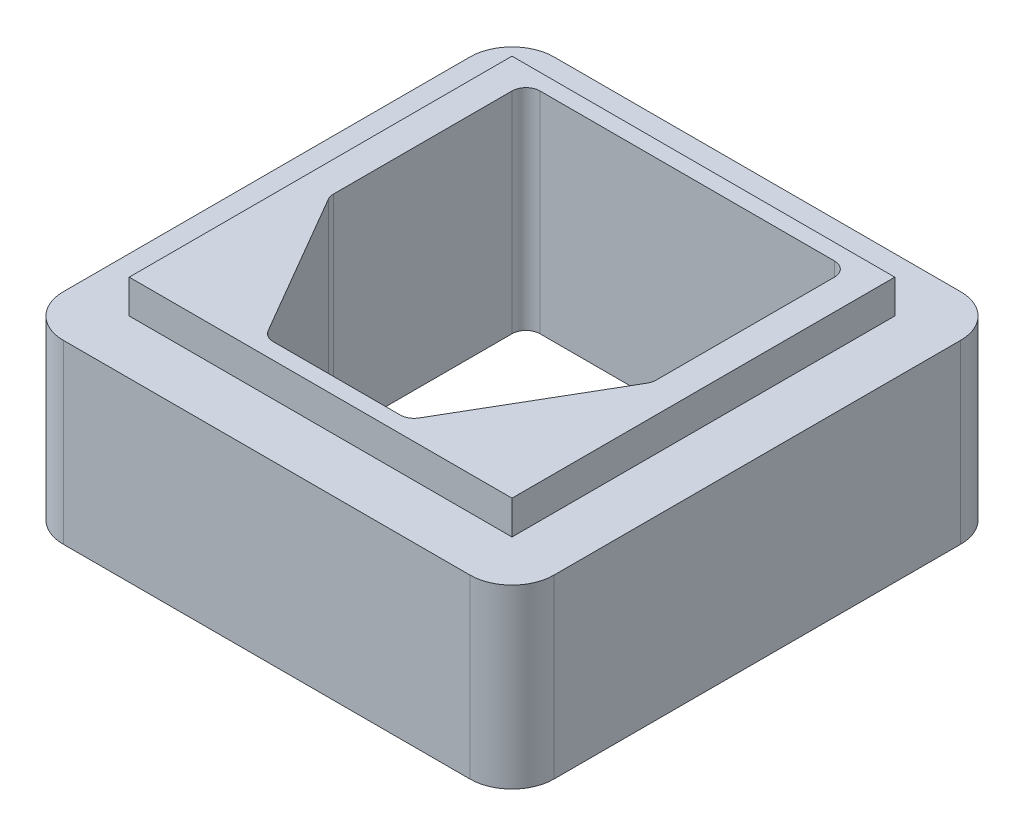
ISO-10303-21;
HEADER;
FILE_DESCRIPTION(('STEP AP214'),'2;1');
FILE_NAME('part.step','',(''),(''),'','','');
FILE_SCHEMA(('AUTOMOTIVE_DESIGN { 1 0 10303 214 1 1 1 1 }'));
ENDSEC;
DATA;
#1=APPLICATION_CONTEXT('core data for automotive mechanical design processes');
#2=APPLICATION_PROTOCOL_DEFINITION('international standard','automotive_design',2000,#1);
#3=PRODUCT_CONTEXT('',#1,'mechanical');
#4=PRODUCT('Part','Part','',(#3));
#5=PRODUCT_RELATED_PRODUCT_CATEGORY('part','',(#4));
#6=PRODUCT_DEFINITION_FORMATION('','',#4);
#7=PRODUCT_DEFINITION_CONTEXT('part definition',#1,'design');
#8=PRODUCT_DEFINITION('design','',#6,#7);
#9=PRODUCT_DEFINITION_SHAPE('','',#8);
#10=(LENGTH_UNIT() NAMED_UNIT(*) SI_UNIT(.MILLI.,.METRE.));
#11=(NAMED_UNIT(*) PLANE_ANGLE_UNIT() SI_UNIT($,.RADIAN.));
#12=(NAMED_UNIT(*) SI_UNIT($,.STERADIAN.) SOLID_ANGLE_UNIT());
#13=UNCERTAINTY_MEASURE_WITH_UNIT(LENGTH_MEASURE(1.E-05),#10,'distance_accuracy_value','');
#14=(GEOMETRIC_REPRESENTATION_CONTEXT(3) GLOBAL_UNCERTAINTY_ASSIGNED_CONTEXT((#13)) GLOBAL_UNIT_ASSIGNED_CONTEXT((#10,
#11,#12)) REPRESENTATION_CONTEXT('',''));
#15=CARTESIAN_POINT('',(0.,0.,0.));
#16=DIRECTION('',(0.,0.,1.));
#17=DIRECTION('',(1.,0.,0.));
#18=AXIS2_PLACEMENT_3D('',#15,#16,#17);
#19=CARTESIAN_POINT('',(0.,15.,0.));
#20=DIRECTION('',(0.,1.,0.));
#21=DIRECTION('',(0.,0.,1.));
#22=AXIS2_PLACEMENT_3D('',#19,#20,#21);
#23=PLANE('',#22);
#24=DIRECTION('',(0.,0.,-1.));
#25=VECTOR('',#24,1.);
#26=CARTESIAN_POINT('',(25.15,15.,-1.14999999999999));
#27=LINE('',#26,#25);
#28=CARTESIAN_POINT('',(25.15,15.,26.15));
#29=VERTEX_POINT('',#28);
#30=CARTESIAN_POINT('',(25.15,15.,-1.14999999999999));
#31=VERTEX_POINT('',#30);
#32=EDGE_CURVE('E417',#29,#31,#27,.T.);
#33=ORIENTED_EDGE('',*,*,#32,.T.);
#34=DIRECTION('',(-1.,0.,0.));
#35=VECTOR('',#34,1.);
#36=CARTESIAN_POINT('',(-2.15,15.,-1.14999999999999));
#37=LINE('',#36,#35);
#38=CARTESIAN_POINT('',(-2.15,15.,-1.14999999999999));
#39=VERTEX_POINT('',#38);
#40=EDGE_CURVE('E445',#31,#39,#37,.T.);
#41=ORIENTED_EDGE('',*,*,#40,.T.);
#42=DIRECTION('',(0.,0.,1.));
#43=VECTOR('',#42,1.);
#44=CARTESIAN_POINT('',(-2.15,15.,-1.14999999999999));
#45=LINE('',#44,#43);
#46=CARTESIAN_POINT('',(-2.15,15.,26.15));
#47=VERTEX_POINT('',#46);
#48=EDGE_CURVE('E448',#39,#47,#45,.T.);
#49=ORIENTED_EDGE('',*,*,#48,.T.);
#50=DIRECTION('',(1.,0.,0.));
#51=VECTOR('',#50,1.);
#52=CARTESIAN_POINT('',(-2.15,15.,26.15));
#53=LINE('',#52,#51);
#54=EDGE_CURVE('E228',#47,#29,#53,.T.);
#55=ORIENTED_EDGE('',*,*,#54,.T.);
#56=EDGE_LOOP('',(#33,#41,#49,#55));
#57=FACE_BOUND('',#56,.T.);
#58=DIRECTION('',(0.502893578303638,0.,0.864348337709377));
#59=VECTOR('',#58,1.);
#60=CARTESIAN_POINT('',(0.,15.,14.));
#61=LINE('',#60,#59);
#62=CARTESIAN_POINT('',(0.135651662290625,15.,14.233151294562));
#63=VERTEX_POINT('',#62);
#64=CARTESIAN_POINT('',(6.11077444555848,15.,24.5028935783036));
#65=VERTEX_POINT('',#64);
#66=EDGE_CURVE('E396',#63,#65,#61,.T.);
#67=ORIENTED_EDGE('',*,*,#66,.F.);
#68=CARTESIAN_POINT('',(1.,15.,13.7302577162584));
#69=DIRECTION('',(0.,1.,0.));
#70=DIRECTION('',(0.,0.,1.));
#71=AXIS2_PLACEMENT_3D('',#68,#69,#70);
#72=CIRCLE('',#71,1.);
#73=CARTESIAN_POINT('',(0.,15.,13.7302577162584));
#74=VERTEX_POINT('',#73);
#75=EDGE_CURVE('E293',#63,#74,#72,.F.);
#76=ORIENTED_EDGE('',*,*,#75,.T.);
#77=DIRECTION('',(0.,0.,1.));
#78=VECTOR('',#77,1.);
#79=CARTESIAN_POINT('',(0.,15.,0.));
#80=LINE('',#79,#78);
#81=CARTESIAN_POINT('',(0.,15.,1.));
#82=VERTEX_POINT('',#81);
#83=EDGE_CURVE('E392',#82,#74,#80,.T.);
#84=ORIENTED_EDGE('',*,*,#83,.F.);
#85=CARTESIAN_POINT('',(1.,15.,1.));
#86=DIRECTION('',(0.,1.,0.));
#87=DIRECTION('',(0.,0.,1.));
#88=AXIS2_PLACEMENT_3D('',#85,#86,#87);
#89=CIRCLE('',#88,1.);
#90=CARTESIAN_POINT('',(1.,15.,0.));
#91=VERTEX_POINT('',#90);
#92=EDGE_CURVE('E317',#82,#91,#89,.F.);
#93=ORIENTED_EDGE('',*,*,#92,.T.);
#94=DIRECTION('',(-1.,0.,0.));
#95=VECTOR('',#94,1.);
#96=CARTESIAN_POINT('',(0.,15.,0.));
#97=LINE('',#96,#95);
#98=CARTESIAN_POINT('',(22.,15.,0.));
#99=VERTEX_POINT('',#98);
#100=EDGE_CURVE('E413',#99,#91,#97,.T.);
#101=ORIENTED_EDGE('',*,*,#100,.F.);
#102=CARTESIAN_POINT('',(22.,15.,1.));
#103=DIRECTION('',(0.,1.,0.));
#104=DIRECTION('',(0.,0.,1.));
#105=AXIS2_PLACEMENT_3D('',#102,#103,#104);
#106=CIRCLE('',#105,1.);
#107=CARTESIAN_POINT('',(23.,15.,1.));
#108=VERTEX_POINT('',#107);
#109=EDGE_CURVE('E311',#99,#108,#106,.F.);
#110=ORIENTED_EDGE('',*,*,#109,.T.);
#111=DIRECTION('',(0.,0.,-1.));
#112=VECTOR('',#111,1.);
#113=CARTESIAN_POINT('',(23.,15.,0.));
#114=LINE('',#113,#112);
#115=CARTESIAN_POINT('',(23.,15.,13.7302577162584));
#116=VERTEX_POINT('',#115);
#117=EDGE_CURVE('E409',#116,#108,#114,.T.);
#118=ORIENTED_EDGE('',*,*,#117,.F.);
#119=CARTESIAN_POINT('',(22.,15.,13.7302577162584));
#120=DIRECTION('',(0.,1.,0.));
#121=DIRECTION('',(0.,0.,1.));
#122=AXIS2_PLACEMENT_3D('',#119,#120,#121);
#123=CIRCLE('',#122,1.);
#124=CARTESIAN_POINT('',(22.8643483377094,15.,14.233151294562));
#125=VERTEX_POINT('',#124);
#126=EDGE_CURVE('E287',#116,#125,#123,.F.);
#127=ORIENTED_EDGE('',*,*,#126,.T.);
#128=DIRECTION('',(0.502893578303637,0.,-0.864348337709377));
#129=VECTOR('',#128,1.);
#130=CARTESIAN_POINT('',(23.,15.,14.));
#131=LINE('',#130,#129);
#132=CARTESIAN_POINT('',(16.8892255544415,15.,24.5028935783036));
#133=VERTEX_POINT('',#132);
#134=EDGE_CURVE('E405',#133,#125,#131,.T.);
#135=ORIENTED_EDGE('',*,*,#134,.F.);
#136=CARTESIAN_POINT('',(16.0248772167321,15.,24.));
#137=DIRECTION('',(0.,1.,0.));
#138=DIRECTION('',(0.,0.,1.));
#139=AXIS2_PLACEMENT_3D('',#136,#137,#138);
#140=CIRCLE('',#139,1.);
#141=CARTESIAN_POINT('',(16.0248772167321,15.,25.));
#142=VERTEX_POINT('',#141);
#143=EDGE_CURVE('E299',#133,#142,#140,.F.);
#144=ORIENTED_EDGE('',*,*,#143,.T.);
#145=DIRECTION('',(1.,0.,0.));
#146=VECTOR('',#145,1.);
#147=CARTESIAN_POINT('',(6.4,15.,25.));
#148=LINE('',#147,#146);
#149=CARTESIAN_POINT('',(6.97512278326786,15.,25.));
#150=VERTEX_POINT('',#149);
#151=EDGE_CURVE('E401',#150,#142,#148,.T.);
#152=ORIENTED_EDGE('',*,*,#151,.F.);
#153=CARTESIAN_POINT('',(6.97512278326786,15.,24.));
#154=DIRECTION('',(0.,1.,0.));
#155=DIRECTION('',(0.,0.,1.));
#156=AXIS2_PLACEMENT_3D('',#153,#154,#155);
#157=CIRCLE('',#156,1.);
#158=EDGE_CURVE('E305',#150,#65,#157,.F.);
#159=ORIENTED_EDGE('',*,*,#158,.T.);
#160=EDGE_LOOP('',(#67,#76,#84,#93,#101,#110,#118,#127,#135,#144,#152,#159));
#161=FACE_BOUND('',#160,.T.);
#162=ADVANCED_FACE('F41',(#57,#161),#23,.T.);
#163=CARTESIAN_POINT('',(0.,0.,0.));
#164=DIRECTION('',(0.,1.,0.));
#165=DIRECTION('',(0.,0.,1.));
#166=AXIS2_PLACEMENT_3D('',#163,#164,#165);
#167=PLANE('',#166);
#168=DIRECTION('',(-1.,0.,0.));
#169=VECTOR('',#168,1.);
#170=CARTESIAN_POINT('',(0.,0.,0.));
#171=LINE('',#170,#169);
#172=CARTESIAN_POINT('',(22.,0.,0.));
#173=VERTEX_POINT('',#172);
#174=CARTESIAN_POINT('',(1.,0.,0.));
#175=VERTEX_POINT('',#174);
#176=EDGE_CURVE('E397',#173,#175,#171,.T.);
#177=ORIENTED_EDGE('',*,*,#176,.T.);
#178=CARTESIAN_POINT('',(1.,0.,1.));
#179=DIRECTION('',(0.,1.,0.));
#180=DIRECTION('',(0.,0.,1.));
#181=AXIS2_PLACEMENT_3D('',#178,#179,#180);
#182=CIRCLE('',#181,1.);
#183=CARTESIAN_POINT('',(0.,0.,1.));
#184=VERTEX_POINT('',#183);
#185=EDGE_CURVE('E314',#175,#184,#182,.T.);
#186=ORIENTED_EDGE('',*,*,#185,.T.);
#187=DIRECTION('',(0.,0.,1.));
#188=VECTOR('',#187,1.);
#189=CARTESIAN_POINT('',(0.,0.,0.));
#190=LINE('',#189,#188);
#191=CARTESIAN_POINT('',(0.,0.,13.7302577162584));
#192=VERTEX_POINT('',#191);
#193=EDGE_CURVE('E418',#184,#192,#190,.T.);
#194=ORIENTED_EDGE('',*,*,#193,.T.);
#195=CARTESIAN_POINT('',(1.,0.,13.7302577162584));
#196=DIRECTION('',(0.,1.,0.));
#197=DIRECTION('',(0.,0.,1.));
#198=AXIS2_PLACEMENT_3D('',#195,#196,#197);
#199=CIRCLE('',#198,1.);
#200=CARTESIAN_POINT('',(0.135651662290625,0.,14.233151294562));
#201=VERTEX_POINT('',#200);
#202=EDGE_CURVE('E290',#192,#201,#199,.T.);
#203=ORIENTED_EDGE('',*,*,#202,.T.);
#204=DIRECTION('',(0.502893578303638,0.,0.864348337709377));
#205=VECTOR('',#204,1.);
#206=CARTESIAN_POINT('',(0.,0.,14.));
#207=LINE('',#206,#205);
#208=CARTESIAN_POINT('',(6.11077444555848,0.,24.5028935783036));
#209=VERTEX_POINT('',#208);
#210=EDGE_CURVE('E422',#201,#209,#207,.T.);
#211=ORIENTED_EDGE('',*,*,#210,.T.);
#212=CARTESIAN_POINT('',(6.97512278326786,0.,24.));
#213=DIRECTION('',(0.,1.,0.));
#214=DIRECTION('',(0.,0.,1.));
#215=AXIS2_PLACEMENT_3D('',#212,#213,#214);
#216=CIRCLE('',#215,1.);
#217=CARTESIAN_POINT('',(6.97512278326786,0.,25.));
#218=VERTEX_POINT('',#217);
#219=EDGE_CURVE('E302',#209,#218,#216,.T.);
#220=ORIENTED_EDGE('',*,*,#219,.T.);
#221=DIRECTION('',(1.,0.,0.));
#222=VECTOR('',#221,1.);
#223=CARTESIAN_POINT('',(6.4,0.,25.));
#224=LINE('',#223,#222);
#225=CARTESIAN_POINT('',(16.0248772167321,0.,25.));
#226=VERTEX_POINT('',#225);
#227=EDGE_CURVE('E427',#218,#226,#224,.T.);
#228=ORIENTED_EDGE('',*,*,#227,.T.);
#229=CARTESIAN_POINT('',(16.0248772167321,0.,24.));
#230=DIRECTION('',(0.,1.,0.));
#231=DIRECTION('',(0.,0.,1.));
#232=AXIS2_PLACEMENT_3D('',#229,#230,#231);
#233=CIRCLE('',#232,1.);
#234=CARTESIAN_POINT('',(16.8892255544415,0.,24.5028935783036));
#235=VERTEX_POINT('',#234);
#236=EDGE_CURVE('E296',#226,#235,#233,.T.);
#237=ORIENTED_EDGE('',*,*,#236,.T.);
#238=DIRECTION('',(0.502893578303637,0.,-0.864348337709377));
#239=VECTOR('',#238,1.);
#240=CARTESIAN_POINT('',(23.,0.,14.));
#241=LINE('',#240,#239);
#242=CARTESIAN_POINT('',(22.8643483377094,0.,14.233151294562));
#243=VERTEX_POINT('',#242);
#244=EDGE_CURVE('E431',#235,#243,#241,.T.);
#245=ORIENTED_EDGE('',*,*,#244,.T.);
#246=CARTESIAN_POINT('',(22.,0.,13.7302577162584));
#247=DIRECTION('',(0.,1.,0.));
#248=DIRECTION('',(0.,0.,1.));
#249=AXIS2_PLACEMENT_3D('',#246,#247,#248);
#250=CIRCLE('',#249,1.);
#251=CARTESIAN_POINT('',(23.,0.,13.7302577162584));
#252=VERTEX_POINT('',#251);
#253=EDGE_CURVE('E284',#243,#252,#250,.T.);
#254=ORIENTED_EDGE('',*,*,#253,.T.);
#255=DIRECTION('',(0.,0.,-1.));
#256=VECTOR('',#255,1.);
#257=CARTESIAN_POINT('',(23.,0.,0.));
#258=LINE('',#257,#256);
#259=CARTESIAN_POINT('',(23.,0.,1.));
#260=VERTEX_POINT('',#259);
#261=EDGE_CURVE('E435',#252,#260,#258,.T.);
#262=ORIENTED_EDGE('',*,*,#261,.T.);
#263=CARTESIAN_POINT('',(22.,0.,1.));
#264=DIRECTION('',(0.,1.,0.));
#265=DIRECTION('',(0.,0.,1.));
#266=AXIS2_PLACEMENT_3D('',#263,#264,#265);
#267=CIRCLE('',#266,1.);
#268=EDGE_CURVE('E308',#260,#173,#267,.T.);
#269=ORIENTED_EDGE('',*,*,#268,.T.);
#270=EDGE_LOOP('',(#177,#186,#194,#203,#211,#220,#228,#237,#245,#254,#262,#269));
#271=FACE_BOUND('',#270,.T.);
#272=DIRECTION('',(-1.,0.,0.));
#273=VECTOR('',#272,1.);
#274=CARTESIAN_POINT('',(-6.,0.,-4.99999999999999));
#275=LINE('',#274,#273);
#276=CARTESIAN_POINT('',(26.,0.,-4.99999999999999));
#277=VERTEX_POINT('',#276);
#278=CARTESIAN_POINT('',(-3.,0.,-4.99999999999999));
#279=VERTEX_POINT('',#278);
#280=EDGE_CURVE('E382',#277,#279,#275,.T.);
#281=ORIENTED_EDGE('',*,*,#280,.F.);
#282=CARTESIAN_POINT('',(26.,0.,-1.99999999999999));
#283=DIRECTION('',(0.,1.,0.));
#284=DIRECTION('',(0.,0.,1.));
#285=AXIS2_PLACEMENT_3D('',#282,#283,#284);
#286=CIRCLE('',#285,3.);
#287=CARTESIAN_POINT('',(29.,0.,-1.99999999999999));
#288=VERTEX_POINT('',#287);
#289=EDGE_CURVE('E336',#277,#288,#286,.F.);
#290=ORIENTED_EDGE('',*,*,#289,.T.);
#291=DIRECTION('',(0.,0.,-1.));
#292=VECTOR('',#291,1.);
#293=CARTESIAN_POINT('',(29.,0.,-4.99999999999999));
#294=LINE('',#293,#292);
#295=CARTESIAN_POINT('',(29.,0.,27.));
#296=VERTEX_POINT('',#295);
#297=EDGE_CURVE('E388',#296,#288,#294,.T.);
#298=ORIENTED_EDGE('',*,*,#297,.F.);
#299=CARTESIAN_POINT('',(26.,0.,27.));
#300=DIRECTION('',(0.,1.,0.));
#301=DIRECTION('',(0.,0.,1.));
#302=AXIS2_PLACEMENT_3D('',#299,#300,#301);
#303=CIRCLE('',#302,3.);
#304=CARTESIAN_POINT('',(26.,0.,30.));
#305=VERTEX_POINT('',#304);
#306=EDGE_CURVE('E327',#296,#305,#303,.F.);
#307=ORIENTED_EDGE('',*,*,#306,.T.);
#308=DIRECTION('',(1.,0.,0.));
#309=VECTOR('',#308,1.);
#310=CARTESIAN_POINT('',(-6.,0.,30.));
#311=LINE('',#310,#309);
#312=CARTESIAN_POINT('',(-3.,0.,30.));
#313=VERTEX_POINT('',#312);
#314=EDGE_CURVE('E381',#313,#305,#311,.T.);
#315=ORIENTED_EDGE('',*,*,#314,.F.);
#316=CARTESIAN_POINT('',(-3.,0.,27.));
#317=DIRECTION('',(0.,1.,0.));
#318=DIRECTION('',(0.,0.,1.));
#319=AXIS2_PLACEMENT_3D('',#316,#317,#318);
#320=CIRCLE('',#319,3.);
#321=CARTESIAN_POINT('',(-6.,0.,27.));
#322=VERTEX_POINT('',#321);
#323=EDGE_CURVE('E330',#313,#322,#320,.F.);
#324=ORIENTED_EDGE('',*,*,#323,.T.);
#325=DIRECTION('',(0.,0.,1.));
#326=VECTOR('',#325,1.);
#327=CARTESIAN_POINT('',(-6.,0.,-4.99999999999999));
#328=LINE('',#327,#326);
#329=CARTESIAN_POINT('',(-6.,0.,-1.99999999999999));
#330=VERTEX_POINT('',#329);
#331=EDGE_CURVE('E370',#330,#322,#328,.T.);
#332=ORIENTED_EDGE('',*,*,#331,.F.);
#333=CARTESIAN_POINT('',(-3.,0.,-1.99999999999999));
#334=DIRECTION('',(0.,1.,0.));
#335=DIRECTION('',(0.,0.,1.));
#336=AXIS2_PLACEMENT_3D('',#333,#334,#335);
#337=CIRCLE('',#336,3.);
#338=EDGE_CURVE('E333',#330,#279,#337,.F.);
#339=ORIENTED_EDGE('',*,*,#338,.T.);
#340=EDGE_LOOP('',(#281,#290,#298,#307,#315,#324,#332,#339));
#341=FACE_BOUND('',#340,.T.);
#342=ADVANCED_FACE('F377',(#271,#341),#167,.F.);
#343=CARTESIAN_POINT('',(25.15,15.,-1.14999999999999));
#344=DIRECTION('',(-1.,0.,0.));
#345=DIRECTION('',(0.,0.,1.));
#346=AXIS2_PLACEMENT_3D('',#343,#344,#345);
#347=PLANE('',#346);
#348=DIRECTION('',(0.,-1.,0.));
#349=VECTOR('',#348,1.);
#350=CARTESIAN_POINT('',(25.15,15.,26.15));
#351=LINE('',#350,#349);
#352=CARTESIAN_POINT('',(25.15,12.6,26.15));
#353=VERTEX_POINT('',#352);
#354=EDGE_CURVE('E230',#29,#353,#351,.T.);
#355=ORIENTED_EDGE('',*,*,#354,.T.);
#356=DIRECTION('',(0.,0.,-1.));
#357=VECTOR('',#356,1.);
#358=CARTESIAN_POINT('',(25.15,12.6,26.15));
#359=LINE('',#358,#357);
#360=CARTESIAN_POINT('',(25.15,12.6,-1.14999999999999));
#361=VERTEX_POINT('',#360);
#362=EDGE_CURVE('E209',#353,#361,#359,.T.);
#363=ORIENTED_EDGE('',*,*,#362,.T.);
#364=DIRECTION('',(0.,-1.,0.));
#365=VECTOR('',#364,1.);
#366=CARTESIAN_POINT('',(25.15,15.,-1.14999999999999));
#367=LINE('',#366,#365);
#368=EDGE_CURVE('E234',#31,#361,#367,.T.);
#369=ORIENTED_EDGE('',*,*,#368,.F.);
#370=ORIENTED_EDGE('',*,*,#32,.F.);
#371=EDGE_LOOP('',(#355,#363,#369,#370));
#372=FACE_BOUND('',#371,.T.);
#373=ADVANCED_FACE('F456',(#372),#347,.F.);
#374=CARTESIAN_POINT('',(-2.15,15.,-1.14999999999999));
#375=DIRECTION('',(0.,0.,1.));
#376=DIRECTION('',(1.,0.,0.));
#377=AXIS2_PLACEMENT_3D('',#374,#375,#376);
#378=PLANE('',#377);
#379=ORIENTED_EDGE('',*,*,#368,.T.);
#380=DIRECTION('',(-1.,0.,0.));
#381=VECTOR('',#380,1.);
#382=CARTESIAN_POINT('',(25.15,12.6,-1.14999999999999));
#383=LINE('',#382,#381);
#384=CARTESIAN_POINT('',(-2.15,12.6,-1.14999999999999));
#385=VERTEX_POINT('',#384);
#386=EDGE_CURVE('E459',#361,#385,#383,.T.);
#387=ORIENTED_EDGE('',*,*,#386,.T.);
#388=DIRECTION('',(0.,-1.,0.));
#389=VECTOR('',#388,1.);
#390=CARTESIAN_POINT('',(-2.15,15.,-1.14999999999999));
#391=LINE('',#390,#389);
#392=EDGE_CURVE('E224',#39,#385,#391,.T.);
#393=ORIENTED_EDGE('',*,*,#392,.F.);
#394=ORIENTED_EDGE('',*,*,#40,.F.);
#395=EDGE_LOOP('',(#379,#387,#393,#394));
#396=FACE_BOUND('',#395,.T.);
#397=ADVANCED_FACE('F458',(#396),#378,.F.);
#398=CARTESIAN_POINT('',(-2.15,15.,-1.14999999999999));
#399=DIRECTION('',(1.,0.,0.));
#400=DIRECTION('',(0.,0.,-1.));
#401=AXIS2_PLACEMENT_3D('',#398,#399,#400);
#402=PLANE('',#401);
#403=ORIENTED_EDGE('',*,*,#392,.T.);
#404=DIRECTION('',(0.,0.,1.));
#405=VECTOR('',#404,1.);
#406=CARTESIAN_POINT('',(-2.15,12.6,-1.14999999999999));
#407=LINE('',#406,#405);
#408=CARTESIAN_POINT('',(-2.15,12.6,26.15));
#409=VERTEX_POINT('',#408);
#410=EDGE_CURVE('E206',#385,#409,#407,.T.);
#411=ORIENTED_EDGE('',*,*,#410,.T.);
#412=DIRECTION('',(0.,-1.,0.));
#413=VECTOR('',#412,1.);
#414=CARTESIAN_POINT('',(-2.15,15.,26.15));
#415=LINE('',#414,#413);
#416=EDGE_CURVE('E221',#47,#409,#415,.T.);
#417=ORIENTED_EDGE('',*,*,#416,.F.);
#418=ORIENTED_EDGE('',*,*,#48,.F.);
#419=EDGE_LOOP('',(#403,#411,#417,#418));
#420=FACE_BOUND('',#419,.T.);
#421=ADVANCED_FACE('F219',(#420),#402,.F.);
#422=CARTESIAN_POINT('',(-2.15,15.,26.15));
#423=DIRECTION('',(0.,0.,-1.));
#424=DIRECTION('',(-1.,0.,0.));
#425=AXIS2_PLACEMENT_3D('',#422,#423,#424);
#426=PLANE('',#425);
#427=ORIENTED_EDGE('',*,*,#416,.T.);
#428=DIRECTION('',(1.,0.,0.));
#429=VECTOR('',#428,1.);
#430=CARTESIAN_POINT('',(-2.15,12.6,26.15));
#431=LINE('',#430,#429);
#432=EDGE_CURVE('E203',#409,#353,#431,.T.);
#433=ORIENTED_EDGE('',*,*,#432,.T.);
#434=ORIENTED_EDGE('',*,*,#354,.F.);
#435=ORIENTED_EDGE('',*,*,#54,.F.);
#436=EDGE_LOOP('',(#427,#433,#434,#435));
#437=FACE_BOUND('',#436,.T.);
#438=ADVANCED_FACE('F227',(#437),#426,.F.);
#439=CARTESIAN_POINT('',(0.,15.,0.));
#440=DIRECTION('',(1.,0.,0.));
#441=DIRECTION('',(0.,0.,-1.));
#442=AXIS2_PLACEMENT_3D('',#439,#440,#441);
#443=PLANE('',#442);
#444=ORIENTED_EDGE('',*,*,#83,.T.);
#445=DIRECTION('',(0.,-1.,0.));
#446=VECTOR('',#445,1.);
#447=CARTESIAN_POINT('',(0.,0.,13.7302577162584));
#448=LINE('',#447,#446);
#449=EDGE_CURVE('E259',#74,#192,#448,.T.);
#450=ORIENTED_EDGE('',*,*,#449,.T.);
#451=ORIENTED_EDGE('',*,*,#193,.F.);
#452=DIRECTION('',(0.,-1.,0.));
#453=VECTOR('',#452,1.);
#454=CARTESIAN_POINT('',(0.,15.,1.));
#455=LINE('',#454,#453);
#456=EDGE_CURVE('E256',#184,#82,#455,.F.);
#457=ORIENTED_EDGE('',*,*,#456,.T.);
#458=EDGE_LOOP('',(#444,#450,#451,#457));
#459=FACE_BOUND('',#458,.T.);
#460=ADVANCED_FACE('F513',(#459),#443,.T.);
#461=CARTESIAN_POINT('',(0.,15.,14.));
#462=DIRECTION('',(0.864348337709377,0.,-0.502893578303638));
#463=DIRECTION('',(-0.502893578303638,0.,-0.864348337709377));
#464=AXIS2_PLACEMENT_3D('',#461,#462,#463);
#465=PLANE('',#464);
#466=ORIENTED_EDGE('',*,*,#210,.F.);
#467=DIRECTION('',(0.,-1.,0.));
#468=VECTOR('',#467,1.);
#469=CARTESIAN_POINT('',(0.135651662290625,15.,14.233151294562));
#470=LINE('',#469,#468);
#471=EDGE_CURVE('E267',#201,#63,#470,.F.);
#472=ORIENTED_EDGE('',*,*,#471,.T.);
#473=ORIENTED_EDGE('',*,*,#66,.T.);
#474=DIRECTION('',(0.,-1.,0.));
#475=VECTOR('',#474,1.);
#476=CARTESIAN_POINT('',(6.11077444555848,0.,24.5028935783036));
#477=LINE('',#476,#475);
#478=EDGE_CURVE('E263',#65,#209,#477,.T.);
#479=ORIENTED_EDGE('',*,*,#478,.T.);
#480=EDGE_LOOP('',(#466,#472,#473,#479));
#481=FACE_BOUND('',#480,.T.);
#482=ADVANCED_FACE('F585',(#481),#465,.T.);
#483=CARTESIAN_POINT('',(6.4,15.,25.));
#484=DIRECTION('',(0.,0.,-1.));
#485=DIRECTION('',(-1.,0.,0.));
#486=AXIS2_PLACEMENT_3D('',#483,#484,#485);
#487=PLANE('',#486);
#488=ORIENTED_EDGE('',*,*,#151,.T.);
#489=DIRECTION('',(0.,-1.,0.));
#490=VECTOR('',#489,1.);
#491=CARTESIAN_POINT('',(16.0248772167321,0.,25.));
#492=LINE('',#491,#490);
#493=EDGE_CURVE('E273',#142,#226,#492,.T.);
#494=ORIENTED_EDGE('',*,*,#493,.T.);
#495=ORIENTED_EDGE('',*,*,#227,.F.);
#496=DIRECTION('',(0.,-1.,0.));
#497=VECTOR('',#496,1.);
#498=CARTESIAN_POINT('',(6.97512278326786,15.,25.));
#499=LINE('',#498,#497);
#500=EDGE_CURVE('E270',#218,#150,#499,.F.);
#501=ORIENTED_EDGE('',*,*,#500,.T.);
#502=EDGE_LOOP('',(#488,#494,#495,#501));
#503=FACE_BOUND('',#502,.T.);
#504=ADVANCED_FACE('F578',(#503),#487,.T.);
#505=CARTESIAN_POINT('',(23.,15.,14.));
#506=DIRECTION('',(-0.864348337709377,0.,-0.502893578303637));
#507=DIRECTION('',(-0.502893578303637,0.,0.864348337709377));
#508=AXIS2_PLACEMENT_3D('',#505,#506,#507);
#509=PLANE('',#508);
#510=ORIENTED_EDGE('',*,*,#134,.T.);
#511=DIRECTION('',(0.,-1.,0.));
#512=VECTOR('',#511,1.);
#513=CARTESIAN_POINT('',(22.8643483377094,0.,14.233151294562));
#514=LINE('',#513,#512);
#515=EDGE_CURVE('E245',#125,#243,#514,.T.);
#516=ORIENTED_EDGE('',*,*,#515,.T.);
#517=ORIENTED_EDGE('',*,*,#244,.F.);
#518=DIRECTION('',(0.,-1.,0.));
#519=VECTOR('',#518,1.);
#520=CARTESIAN_POINT('',(16.8892255544415,15.,24.5028935783036));
#521=LINE('',#520,#519);
#522=EDGE_CURVE('E242',#235,#133,#521,.F.);
#523=ORIENTED_EDGE('',*,*,#522,.T.);
#524=EDGE_LOOP('',(#510,#516,#517,#523));
#525=FACE_BOUND('',#524,.T.);
#526=ADVANCED_FACE('F571',(#525),#509,.T.);
#527=CARTESIAN_POINT('',(23.,15.,0.));
#528=DIRECTION('',(-1.,0.,0.));
#529=DIRECTION('',(0.,0.,1.));
#530=AXIS2_PLACEMENT_3D('',#527,#528,#529);
#531=PLANE('',#530);
#532=ORIENTED_EDGE('',*,*,#261,.F.);
#533=DIRECTION('',(0.,-1.,0.));
#534=VECTOR('',#533,1.);
#535=CARTESIAN_POINT('',(23.,15.,13.7302577162584));
#536=LINE('',#535,#534);
#537=EDGE_CURVE('E253',#252,#116,#536,.F.);
#538=ORIENTED_EDGE('',*,*,#537,.T.);
#539=ORIENTED_EDGE('',*,*,#117,.T.);
#540=DIRECTION('',(0.,-1.,0.));
#541=VECTOR('',#540,1.);
#542=CARTESIAN_POINT('',(23.,0.,1.));
#543=LINE('',#542,#541);
#544=EDGE_CURVE('E249',#108,#260,#543,.T.);
#545=ORIENTED_EDGE('',*,*,#544,.T.);
#546=EDGE_LOOP('',(#532,#538,#539,#545));
#547=FACE_BOUND('',#546,.T.);
#548=ADVANCED_FACE('F565',(#547),#531,.T.);
#549=CARTESIAN_POINT('',(0.,15.,0.));
#550=DIRECTION('',(0.,0.,1.));
#551=DIRECTION('',(1.,0.,0.));
#552=AXIS2_PLACEMENT_3D('',#549,#550,#551);
#553=PLANE('',#552);
#554=ORIENTED_EDGE('',*,*,#176,.F.);
#555=DIRECTION('',(0.,-1.,0.));
#556=VECTOR('',#555,1.);
#557=CARTESIAN_POINT('',(22.,15.,0.));
#558=LINE('',#557,#556);
#559=EDGE_CURVE('E281',#173,#99,#558,.F.);
#560=ORIENTED_EDGE('',*,*,#559,.T.);
#561=ORIENTED_EDGE('',*,*,#100,.T.);
#562=DIRECTION('',(0.,-1.,0.));
#563=VECTOR('',#562,1.);
#564=CARTESIAN_POINT('',(1.,0.,0.));
#565=LINE('',#564,#563);
#566=EDGE_CURVE('E277',#91,#175,#565,.T.);
#567=ORIENTED_EDGE('',*,*,#566,.T.);
#568=EDGE_LOOP('',(#554,#560,#561,#567));
#569=FACE_BOUND('',#568,.T.);
#570=ADVANCED_FACE('F558',(#569),#553,.T.);
#571=CARTESIAN_POINT('',(0.,12.6,0.));
#572=DIRECTION('',(0.,1.,0.));
#573=DIRECTION('',(0.,0.,1.));
#574=AXIS2_PLACEMENT_3D('',#571,#572,#573);
#575=PLANE('',#574);
#576=DIRECTION('',(0.,0.,-1.));
#577=VECTOR('',#576,1.);
#578=CARTESIAN_POINT('',(29.,12.6,-4.99999999999999));
#579=LINE('',#578,#577);
#580=CARTESIAN_POINT('',(29.,12.6,27.));
#581=VERTEX_POINT('',#580);
#582=CARTESIAN_POINT('',(29.,12.6,-1.99999999999999));
#583=VERTEX_POINT('',#582);
#584=EDGE_CURVE('E386',#581,#583,#579,.T.);
#585=ORIENTED_EDGE('',*,*,#584,.T.);
#586=CARTESIAN_POINT('',(26.,12.6,-1.99999999999999));
#587=DIRECTION('',(0.,1.,0.));
#588=DIRECTION('',(0.,0.,1.));
#589=AXIS2_PLACEMENT_3D('',#586,#587,#588);
#590=CIRCLE('',#589,3.);
#591=CARTESIAN_POINT('',(26.,12.6,-4.99999999999999));
#592=VERTEX_POINT('',#591);
#593=EDGE_CURVE('E354',#583,#592,#590,.T.);
#594=ORIENTED_EDGE('',*,*,#593,.T.);
#595=DIRECTION('',(-1.,0.,0.));
#596=VECTOR('',#595,1.);
#597=CARTESIAN_POINT('',(-6.,12.6,-4.99999999999999));
#598=LINE('',#597,#596);
#599=CARTESIAN_POINT('',(-3.,12.6,-4.99999999999999));
#600=VERTEX_POINT('',#599);
#601=EDGE_CURVE('E470',#592,#600,#598,.T.);
#602=ORIENTED_EDGE('',*,*,#601,.T.);
#603=CARTESIAN_POINT('',(-3.,12.6,-1.99999999999999));
#604=DIRECTION('',(0.,1.,0.));
#605=DIRECTION('',(0.,0.,1.));
#606=AXIS2_PLACEMENT_3D('',#603,#604,#605);
#607=CIRCLE('',#606,3.);
#608=CARTESIAN_POINT('',(-6.,12.6,-1.99999999999999));
#609=VERTEX_POINT('',#608);
#610=EDGE_CURVE('E351',#600,#609,#607,.T.);
#611=ORIENTED_EDGE('',*,*,#610,.T.);
#612=DIRECTION('',(0.,0.,1.));
#613=VECTOR('',#612,1.);
#614=CARTESIAN_POINT('',(-6.,12.6,-4.99999999999999));
#615=LINE('',#614,#613);
#616=CARTESIAN_POINT('',(-6.,12.6,27.));
#617=VERTEX_POINT('',#616);
#618=EDGE_CURVE('E372',#609,#617,#615,.T.);
#619=ORIENTED_EDGE('',*,*,#618,.T.);
#620=CARTESIAN_POINT('',(-3.,12.6,27.));
#621=DIRECTION('',(0.,1.,0.));
#622=DIRECTION('',(0.,0.,1.));
#623=AXIS2_PLACEMENT_3D('',#620,#621,#622);
#624=CIRCLE('',#623,3.);
#625=CARTESIAN_POINT('',(-3.,12.6,30.));
#626=VERTEX_POINT('',#625);
#627=EDGE_CURVE('E63',#617,#626,#624,.T.);
#628=ORIENTED_EDGE('',*,*,#627,.T.);
#629=DIRECTION('',(1.,0.,0.));
#630=VECTOR('',#629,1.);
#631=CARTESIAN_POINT('',(-6.,12.6,30.));
#632=LINE('',#631,#630);
#633=CARTESIAN_POINT('',(26.,12.6,30.));
#634=VERTEX_POINT('',#633);
#635=EDGE_CURVE('E423',#626,#634,#632,.T.);
#636=ORIENTED_EDGE('',*,*,#635,.T.);
#637=CARTESIAN_POINT('',(26.,12.6,27.));
#638=DIRECTION('',(0.,1.,0.));
#639=DIRECTION('',(0.,0.,1.));
#640=AXIS2_PLACEMENT_3D('',#637,#638,#639);
#641=CIRCLE('',#640,3.);
#642=EDGE_CURVE('E346',#634,#581,#641,.T.);
#643=ORIENTED_EDGE('',*,*,#642,.T.);
#644=EDGE_LOOP('',(#585,#594,#602,#611,#619,#628,#636,#643));
#645=FACE_BOUND('',#644,.T.);
#646=ORIENTED_EDGE('',*,*,#432,.F.);
#647=ORIENTED_EDGE('',*,*,#410,.F.);
#648=ORIENTED_EDGE('',*,*,#386,.F.);
#649=ORIENTED_EDGE('',*,*,#362,.F.);
#650=EDGE_LOOP('',(#646,#647,#648,#649));
#651=FACE_BOUND('',#650,.T.);
#652=ADVANCED_FACE('F205',(#645,#651),#575,.T.);
#653=CARTESIAN_POINT('',(29.,12.6,-4.99999999999999));
#654=DIRECTION('',(-1.,0.,0.));
#655=DIRECTION('',(0.,0.,1.));
#656=AXIS2_PLACEMENT_3D('',#653,#654,#655);
#657=PLANE('',#656);
#658=ORIENTED_EDGE('',*,*,#297,.T.);
#659=DIRECTION('',(0.,-1.,0.));
#660=VECTOR('',#659,1.);
#661=CARTESIAN_POINT('',(29.,12.6,-1.99999999999999));
#662=LINE('',#661,#660);
#663=EDGE_CURVE('E343',#288,#583,#662,.F.);
#664=ORIENTED_EDGE('',*,*,#663,.T.);
#665=ORIENTED_EDGE('',*,*,#584,.F.);
#666=DIRECTION('',(0.,-1.,0.));
#667=VECTOR('',#666,1.);
#668=CARTESIAN_POINT('',(29.,12.6,27.));
#669=LINE('',#668,#667);
#670=EDGE_CURVE('E339',#581,#296,#669,.T.);
#671=ORIENTED_EDGE('',*,*,#670,.T.);
#672=EDGE_LOOP('',(#658,#664,#665,#671));
#673=FACE_BOUND('',#672,.T.);
#674=ADVANCED_FACE('F484',(#673),#657,.F.);
#675=CARTESIAN_POINT('',(-6.,12.6,-4.99999999999999));
#676=DIRECTION('',(0.,0.,1.));
#677=DIRECTION('',(1.,0.,0.));
#678=AXIS2_PLACEMENT_3D('',#675,#676,#677);
#679=PLANE('',#678);
#680=ORIENTED_EDGE('',*,*,#601,.F.);
#681=DIRECTION('',(0.,-1.,0.));
#682=VECTOR('',#681,1.);
#683=CARTESIAN_POINT('',(26.,12.6,-4.99999999999999));
#684=LINE('',#683,#682);
#685=EDGE_CURVE('E323',#592,#277,#684,.T.);
#686=ORIENTED_EDGE('',*,*,#685,.T.);
#687=ORIENTED_EDGE('',*,*,#280,.T.);
#688=DIRECTION('',(0.,-1.,0.));
#689=VECTOR('',#688,1.);
#690=CARTESIAN_POINT('',(-3.,12.6,-4.99999999999999));
#691=LINE('',#690,#689);
#692=EDGE_CURVE('E320',#279,#600,#691,.F.);
#693=ORIENTED_EDGE('',*,*,#692,.T.);
#694=EDGE_LOOP('',(#680,#686,#687,#693));
#695=FACE_BOUND('',#694,.T.);
#696=ADVANCED_FACE('F492',(#695),#679,.F.);
#697=CARTESIAN_POINT('',(-6.,12.6,-4.99999999999999));
#698=DIRECTION('',(1.,0.,0.));
#699=DIRECTION('',(0.,0.,-1.));
#700=AXIS2_PLACEMENT_3D('',#697,#698,#699);
#701=PLANE('',#700);
#702=ORIENTED_EDGE('',*,*,#618,.F.);
#703=DIRECTION('',(0.,-1.,0.));
#704=VECTOR('',#703,1.);
#705=CARTESIAN_POINT('',(-6.,12.6,-1.99999999999999));
#706=LINE('',#705,#704);
#707=EDGE_CURVE('E360',#609,#330,#706,.T.);
#708=ORIENTED_EDGE('',*,*,#707,.T.);
#709=ORIENTED_EDGE('',*,*,#331,.T.);
#710=DIRECTION('',(0.,-1.,0.));
#711=VECTOR('',#710,1.);
#712=CARTESIAN_POINT('',(-6.,12.6,27.));
#713=LINE('',#712,#711);
#714=EDGE_CURVE('E357',#322,#617,#713,.F.);
#715=ORIENTED_EDGE('',*,*,#714,.T.);
#716=EDGE_LOOP('',(#702,#708,#709,#715));
#717=FACE_BOUND('',#716,.T.);
#718=ADVANCED_FACE('F369',(#717),#701,.F.);
#719=CARTESIAN_POINT('',(-6.,12.6,30.));
#720=DIRECTION('',(0.,0.,-1.));
#721=DIRECTION('',(-1.,0.,0.));
#722=AXIS2_PLACEMENT_3D('',#719,#720,#721);
#723=PLANE('',#722);
#724=ORIENTED_EDGE('',*,*,#635,.F.);
#725=DIRECTION('',(0.,-1.,0.));
#726=VECTOR('',#725,1.);
#727=CARTESIAN_POINT('',(-3.,12.6,30.));
#728=LINE('',#727,#726);
#729=EDGE_CURVE('E12',#626,#313,#728,.T.);
#730=ORIENTED_EDGE('',*,*,#729,.T.);
#731=ORIENTED_EDGE('',*,*,#314,.T.);
#732=DIRECTION('',(0.,-1.,0.));
#733=VECTOR('',#732,1.);
#734=CARTESIAN_POINT('',(26.,12.6,30.));
#735=LINE('',#734,#733);
#736=EDGE_CURVE('E50',#305,#634,#735,.F.);
#737=ORIENTED_EDGE('',*,*,#736,.T.);
#738=EDGE_LOOP('',(#724,#730,#731,#737));
#739=FACE_BOUND('',#738,.T.);
#740=ADVANCED_FACE('F528',(#739),#723,.F.);
#741=CARTESIAN_POINT('',(22.,15.,13.7302577162584));
#742=DIRECTION('',(0.,1.,0.));
#743=DIRECTION('',(0.,0.,1.));
#744=AXIS2_PLACEMENT_3D('',#741,#742,#743);
#745=CYLINDRICAL_SURFACE('',#744,1.);
#746=ORIENTED_EDGE('',*,*,#126,.F.);
#747=ORIENTED_EDGE('',*,*,#537,.F.);
#748=ORIENTED_EDGE('',*,*,#253,.F.);
#749=ORIENTED_EDGE('',*,*,#515,.F.);
#750=EDGE_LOOP('',(#746,#747,#748,#749));
#751=FACE_BOUND('',#750,.T.);
#752=ADVANCED_FACE('F524',(#751),#745,.F.);
#753=CARTESIAN_POINT('',(1.,15.,13.7302577162584));
#754=DIRECTION('',(0.,1.,0.));
#755=DIRECTION('',(0.,0.,1.));
#756=AXIS2_PLACEMENT_3D('',#753,#754,#755);
#757=CYLINDRICAL_SURFACE('',#756,1.);
#758=ORIENTED_EDGE('',*,*,#75,.F.);
#759=ORIENTED_EDGE('',*,*,#471,.F.);
#760=ORIENTED_EDGE('',*,*,#202,.F.);
#761=ORIENTED_EDGE('',*,*,#449,.F.);
#762=EDGE_LOOP('',(#758,#759,#760,#761));
#763=FACE_BOUND('',#762,.T.);
#764=ADVANCED_FACE('F527',(#763),#757,.F.);
#765=CARTESIAN_POINT('',(16.0248772167321,15.,24.));
#766=DIRECTION('',(0.,1.,0.));
#767=DIRECTION('',(0.,0.,1.));
#768=AXIS2_PLACEMENT_3D('',#765,#766,#767);
#769=CYLINDRICAL_SURFACE('',#768,1.);
#770=ORIENTED_EDGE('',*,*,#143,.F.);
#771=ORIENTED_EDGE('',*,*,#522,.F.);
#772=ORIENTED_EDGE('',*,*,#236,.F.);
#773=ORIENTED_EDGE('',*,*,#493,.F.);
#774=EDGE_LOOP('',(#770,#771,#772,#773));
#775=FACE_BOUND('',#774,.T.);
#776=ADVANCED_FACE('F532',(#775),#769,.F.);
#777=CARTESIAN_POINT('',(6.97512278326786,15.,24.));
#778=DIRECTION('',(0.,1.,0.));
#779=DIRECTION('',(0.,0.,1.));
#780=AXIS2_PLACEMENT_3D('',#777,#778,#779);
#781=CYLINDRICAL_SURFACE('',#780,1.);
#782=ORIENTED_EDGE('',*,*,#158,.F.);
#783=ORIENTED_EDGE('',*,*,#500,.F.);
#784=ORIENTED_EDGE('',*,*,#219,.F.);
#785=ORIENTED_EDGE('',*,*,#478,.F.);
#786=EDGE_LOOP('',(#782,#783,#784,#785));
#787=FACE_BOUND('',#786,.T.);
#788=ADVANCED_FACE('F536',(#787),#781,.F.);
#789=CARTESIAN_POINT('',(22.,15.,1.));
#790=DIRECTION('',(0.,1.,0.));
#791=DIRECTION('',(0.,0.,1.));
#792=AXIS2_PLACEMENT_3D('',#789,#790,#791);
#793=CYLINDRICAL_SURFACE('',#792,1.);
#794=ORIENTED_EDGE('',*,*,#109,.F.);
#795=ORIENTED_EDGE('',*,*,#559,.F.);
#796=ORIENTED_EDGE('',*,*,#268,.F.);
#797=ORIENTED_EDGE('',*,*,#544,.F.);
#798=EDGE_LOOP('',(#794,#795,#796,#797));
#799=FACE_BOUND('',#798,.T.);
#800=ADVANCED_FACE('F540',(#799),#793,.F.);
#801=CARTESIAN_POINT('',(1.,15.,1.));
#802=DIRECTION('',(0.,1.,0.));
#803=DIRECTION('',(0.,0.,1.));
#804=AXIS2_PLACEMENT_3D('',#801,#802,#803);
#805=CYLINDRICAL_SURFACE('',#804,1.);
#806=ORIENTED_EDGE('',*,*,#92,.F.);
#807=ORIENTED_EDGE('',*,*,#456,.F.);
#808=ORIENTED_EDGE('',*,*,#185,.F.);
#809=ORIENTED_EDGE('',*,*,#566,.F.);
#810=EDGE_LOOP('',(#806,#807,#808,#809));
#811=FACE_BOUND('',#810,.T.);
#812=ADVANCED_FACE('F503',(#811),#805,.F.);
#813=CARTESIAN_POINT('',(26.,12.6,-1.99999999999999));
#814=DIRECTION('',(0.,-1.,0.));
#815=DIRECTION('',(0.,0.,-1.));
#816=AXIS2_PLACEMENT_3D('',#813,#814,#815);
#817=CYLINDRICAL_SURFACE('',#816,3.);
#818=ORIENTED_EDGE('',*,*,#593,.F.);
#819=ORIENTED_EDGE('',*,*,#663,.F.);
#820=ORIENTED_EDGE('',*,*,#289,.F.);
#821=ORIENTED_EDGE('',*,*,#685,.F.);
#822=EDGE_LOOP('',(#818,#819,#820,#821));
#823=FACE_BOUND('',#822,.T.);
#824=ADVANCED_FACE('F489',(#823),#817,.T.);
#825=CARTESIAN_POINT('',(-3.,12.6,-1.99999999999999));
#826=DIRECTION('',(0.,-1.,0.));
#827=DIRECTION('',(0.,0.,-1.));
#828=AXIS2_PLACEMENT_3D('',#825,#826,#827);
#829=CYLINDRICAL_SURFACE('',#828,3.);
#830=ORIENTED_EDGE('',*,*,#610,.F.);
#831=ORIENTED_EDGE('',*,*,#692,.F.);
#832=ORIENTED_EDGE('',*,*,#338,.F.);
#833=ORIENTED_EDGE('',*,*,#707,.F.);
#834=EDGE_LOOP('',(#830,#831,#832,#833));
#835=FACE_BOUND('',#834,.T.);
#836=ADVANCED_FACE('F494',(#835),#829,.T.);
#837=CARTESIAN_POINT('',(-3.,12.6,27.));
#838=DIRECTION('',(0.,-1.,0.));
#839=DIRECTION('',(0.,0.,-1.));
#840=AXIS2_PLACEMENT_3D('',#837,#838,#839);
#841=CYLINDRICAL_SURFACE('',#840,3.);
#842=ORIENTED_EDGE('',*,*,#627,.F.);
#843=ORIENTED_EDGE('',*,*,#714,.F.);
#844=ORIENTED_EDGE('',*,*,#323,.F.);
#845=ORIENTED_EDGE('',*,*,#729,.F.);
#846=EDGE_LOOP('',(#842,#843,#844,#845));
#847=FACE_BOUND('',#846,.T.);
#848=ADVANCED_FACE('F496',(#847),#841,.T.);
#849=CARTESIAN_POINT('',(26.,12.6,27.));
#850=DIRECTION('',(0.,-1.,0.));
#851=DIRECTION('',(0.,0.,-1.));
#852=AXIS2_PLACEMENT_3D('',#849,#850,#851);
#853=CYLINDRICAL_SURFACE('',#852,3.);
#854=ORIENTED_EDGE('',*,*,#642,.F.);
#855=ORIENTED_EDGE('',*,*,#736,.F.);
#856=ORIENTED_EDGE('',*,*,#306,.F.);
#857=ORIENTED_EDGE('',*,*,#670,.F.);
#858=EDGE_LOOP('',(#854,#855,#856,#857));
#859=FACE_BOUND('',#858,.T.);
#860=ADVANCED_FACE('F43',(#859),#853,.T.);
#861=CLOSED_SHELL('',(#162,#342,#373,#397,#421,#438,#460,#482,#504,#526,#548,#570,#652,#674,
#696,#718,#740,#752,#764,#776,#788,#800,#812,#824,#836,#848,#860));
#862=MANIFOLD_SOLID_BREP('B2',#861);
#863=ADVANCED_BREP_SHAPE_REPRESENTATION('',(#18,#862),#14);
#864=SHAPE_DEFINITION_REPRESENTATION(#9,#863);
ENDSEC;
END-ISO-10303-21;
